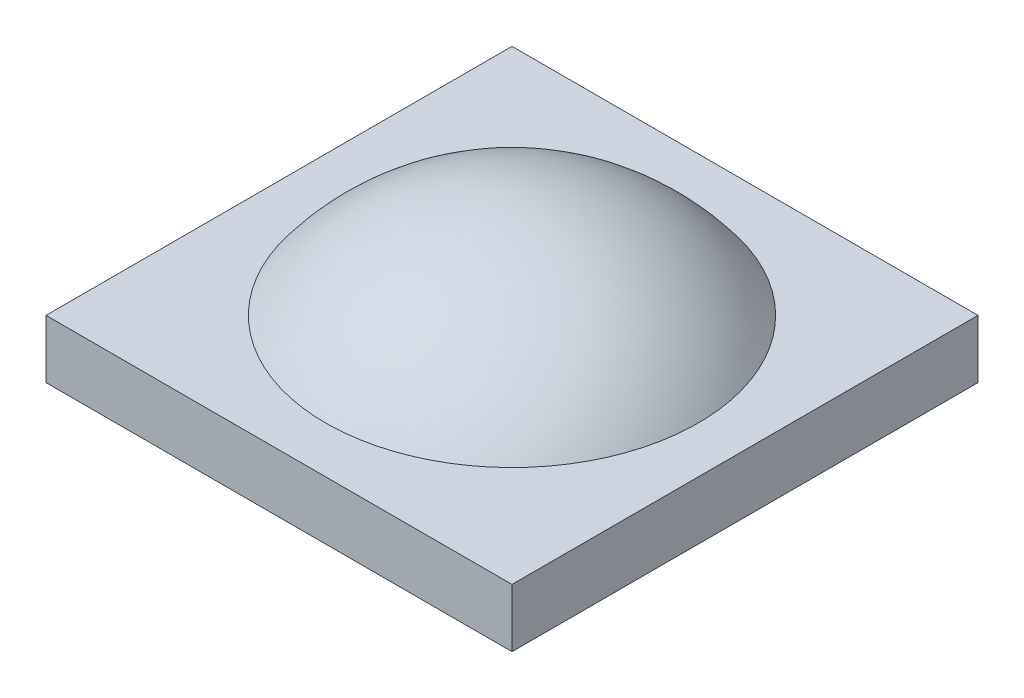
ISO-10303-21;
HEADER;
FILE_DESCRIPTION(('STEP AP214'),'2;1');
FILE_NAME('part.step','',(''),(''),'','','');
FILE_SCHEMA(('AUTOMOTIVE_DESIGN { 1 0 10303 214 1 1 1 1 }'));
ENDSEC;
DATA;
#1=APPLICATION_CONTEXT('core data for automotive mechanical design processes');
#2=APPLICATION_PROTOCOL_DEFINITION('international standard','automotive_design',2000,#1);
#3=PRODUCT_CONTEXT('',#1,'mechanical');
#4=PRODUCT('Part','Part','',(#3));
#5=PRODUCT_RELATED_PRODUCT_CATEGORY('part','',(#4));
#6=PRODUCT_DEFINITION_FORMATION('','',#4);
#7=PRODUCT_DEFINITION_CONTEXT('part definition',#1,'design');
#8=PRODUCT_DEFINITION('design','',#6,#7);
#9=PRODUCT_DEFINITION_SHAPE('','',#8);
#10=(LENGTH_UNIT() NAMED_UNIT(*) SI_UNIT(.MILLI.,.METRE.));
#11=(NAMED_UNIT(*) PLANE_ANGLE_UNIT() SI_UNIT($,.RADIAN.));
#12=(NAMED_UNIT(*) SI_UNIT($,.STERADIAN.) SOLID_ANGLE_UNIT());
#13=UNCERTAINTY_MEASURE_WITH_UNIT(LENGTH_MEASURE(1.E-05),#10,'distance_accuracy_value','');
#14=(GEOMETRIC_REPRESENTATION_CONTEXT(3) GLOBAL_UNCERTAINTY_ASSIGNED_CONTEXT((#13)) GLOBAL_UNIT_ASSIGNED_CONTEXT((#10,
#11,#12)) REPRESENTATION_CONTEXT('',''));
#15=CARTESIAN_POINT('',(0.,0.,0.));
#16=DIRECTION('',(0.,0.,1.));
#17=DIRECTION('',(1.,0.,0.));
#18=AXIS2_PLACEMENT_3D('',#15,#16,#17);
#19=CARTESIAN_POINT('',(25.4,6.35,25.4));
#20=DIRECTION('',(-1.,0.,0.));
#21=DIRECTION('',(0.,0.,1.));
#22=AXIS2_PLACEMENT_3D('',#19,#20,#21);
#23=PLANE('',#22);
#24=DIRECTION('',(0.,0.,-1.));
#25=VECTOR('',#24,1.);
#26=CARTESIAN_POINT('',(25.4,0.,25.4));
#27=LINE('',#26,#25);
#28=CARTESIAN_POINT('',(25.4,0.,25.4));
#29=VERTEX_POINT('',#28);
#30=CARTESIAN_POINT('',(25.4,0.,-25.4));
#31=VERTEX_POINT('',#30);
#32=EDGE_CURVE('E102',#29,#31,#27,.T.);
#33=ORIENTED_EDGE('',*,*,#32,.T.);
#34=DIRECTION('',(0.,-1.,0.));
#35=VECTOR('',#34,1.);
#36=CARTESIAN_POINT('',(25.4,6.35,-25.4));
#37=LINE('',#36,#35);
#38=CARTESIAN_POINT('',(25.4,6.35,-25.4));
#39=VERTEX_POINT('',#38);
#40=EDGE_CURVE('E11',#39,#31,#37,.T.);
#41=ORIENTED_EDGE('',*,*,#40,.F.);
#42=DIRECTION('',(0.,0.,-1.));
#43=VECTOR('',#42,1.);
#44=CARTESIAN_POINT('',(25.4,6.35,25.4));
#45=LINE('',#44,#43);
#46=CARTESIAN_POINT('',(25.4,6.35,25.4));
#47=VERTEX_POINT('',#46);
#48=EDGE_CURVE('E90',#47,#39,#45,.T.);
#49=ORIENTED_EDGE('',*,*,#48,.F.);
#50=DIRECTION('',(0.,-1.,0.));
#51=VECTOR('',#50,1.);
#52=CARTESIAN_POINT('',(25.4,6.35,25.4));
#53=LINE('',#52,#51);
#54=EDGE_CURVE('E98',#47,#29,#53,.T.);
#55=ORIENTED_EDGE('',*,*,#54,.T.);
#56=EDGE_LOOP('',(#33,#41,#49,#55));
#57=FACE_BOUND('',#56,.T.);
#58=ADVANCED_FACE('F39',(#57),#23,.F.);
#59=CARTESIAN_POINT('',(-25.4,6.35,-25.4));
#60=DIRECTION('',(0.,0.,1.));
#61=DIRECTION('',(1.,0.,0.));
#62=AXIS2_PLACEMENT_3D('',#59,#60,#61);
#63=PLANE('',#62);
#64=DIRECTION('',(-1.,0.,0.));
#65=VECTOR('',#64,1.);
#66=CARTESIAN_POINT('',(-25.4,0.,-25.4));
#67=LINE('',#66,#65);
#68=CARTESIAN_POINT('',(-25.4,0.,-25.4));
#69=VERTEX_POINT('',#68);
#70=EDGE_CURVE('E94',#31,#69,#67,.T.);
#71=ORIENTED_EDGE('',*,*,#70,.T.);
#72=DIRECTION('',(0.,-1.,0.));
#73=VECTOR('',#72,1.);
#74=CARTESIAN_POINT('',(-25.4,6.35,-25.4));
#75=LINE('',#74,#73);
#76=CARTESIAN_POINT('',(-25.4,6.35,-25.4));
#77=VERTEX_POINT('',#76);
#78=EDGE_CURVE('E47',#77,#69,#75,.T.);
#79=ORIENTED_EDGE('',*,*,#78,.F.);
#80=DIRECTION('',(-1.,0.,0.));
#81=VECTOR('',#80,1.);
#82=CARTESIAN_POINT('',(-25.4,6.35,-25.4));
#83=LINE('',#82,#81);
#84=EDGE_CURVE('E85',#39,#77,#83,.T.);
#85=ORIENTED_EDGE('',*,*,#84,.F.);
#86=ORIENTED_EDGE('',*,*,#40,.T.);
#87=EDGE_LOOP('',(#71,#79,#85,#86));
#88=FACE_BOUND('',#87,.T.);
#89=ADVANCED_FACE('F93',(#88),#63,.F.);
#90=CARTESIAN_POINT('',(-25.4,6.35,25.4));
#91=DIRECTION('',(1.,0.,0.));
#92=DIRECTION('',(0.,0.,-1.));
#93=AXIS2_PLACEMENT_3D('',#90,#91,#92);
#94=PLANE('',#93);
#95=DIRECTION('',(0.,0.,1.));
#96=VECTOR('',#95,1.);
#97=CARTESIAN_POINT('',(-25.4,0.,25.4));
#98=LINE('',#97,#96);
#99=CARTESIAN_POINT('',(-25.4,0.,25.4));
#100=VERTEX_POINT('',#99);
#101=EDGE_CURVE('E72',#69,#100,#98,.T.);
#102=ORIENTED_EDGE('',*,*,#101,.T.);
#103=DIRECTION('',(0.,-1.,0.));
#104=VECTOR('',#103,1.);
#105=CARTESIAN_POINT('',(-25.4,6.35,25.4));
#106=LINE('',#105,#104);
#107=CARTESIAN_POINT('',(-25.4,6.35,25.4));
#108=VERTEX_POINT('',#107);
#109=EDGE_CURVE('E95',#108,#100,#106,.T.);
#110=ORIENTED_EDGE('',*,*,#109,.F.);
#111=DIRECTION('',(0.,0.,1.));
#112=VECTOR('',#111,1.);
#113=CARTESIAN_POINT('',(-25.4,6.35,25.4));
#114=LINE('',#113,#112);
#115=EDGE_CURVE('E88',#77,#108,#114,.T.);
#116=ORIENTED_EDGE('',*,*,#115,.F.);
#117=ORIENTED_EDGE('',*,*,#78,.T.);
#118=EDGE_LOOP('',(#102,#110,#116,#117));
#119=FACE_BOUND('',#118,.T.);
#120=ADVANCED_FACE('F96',(#119),#94,.F.);
#121=CARTESIAN_POINT('',(-25.4,6.35,25.4));
#122=DIRECTION('',(0.,0.,-1.));
#123=DIRECTION('',(-1.,0.,0.));
#124=AXIS2_PLACEMENT_3D('',#121,#122,#123);
#125=PLANE('',#124);
#126=DIRECTION('',(1.,0.,0.));
#127=VECTOR('',#126,1.);
#128=CARTESIAN_POINT('',(-25.4,0.,25.4));
#129=LINE('',#128,#127);
#130=EDGE_CURVE('E78',#100,#29,#129,.T.);
#131=ORIENTED_EDGE('',*,*,#130,.T.);
#132=ORIENTED_EDGE('',*,*,#54,.F.);
#133=DIRECTION('',(1.,0.,0.));
#134=VECTOR('',#133,1.);
#135=CARTESIAN_POINT('',(-25.4,6.35,25.4));
#136=LINE('',#135,#134);
#137=EDGE_CURVE('E55',#108,#47,#136,.T.);
#138=ORIENTED_EDGE('',*,*,#137,.F.);
#139=ORIENTED_EDGE('',*,*,#109,.T.);
#140=EDGE_LOOP('',(#131,#132,#138,#139));
#141=FACE_BOUND('',#140,.T.);
#142=ADVANCED_FACE('F110',(#141),#125,.F.);
#143=CARTESIAN_POINT('',(0.,6.35,0.));
#144=DIRECTION('',(0.,-1.,0.));
#145=DIRECTION('',(0.,0.,-1.));
#146=AXIS2_PLACEMENT_3D('',#143,#144,#145);
#147=PLANE('',#146);
#148=CARTESIAN_POINT('',(0.,6.35,0.));
#149=DIRECTION('',(0.,1.,0.));
#150=DIRECTION('',(-1.,0.,0.));
#151=AXIS2_PLACEMENT_3D('',#148,#149,#150);
#152=CIRCLE('',#151,20.32);
#153=CARTESIAN_POINT('',(-20.32,6.35,0.));
#154=VERTEX_POINT('',#153);
#155=EDGE_CURVE('E105',#154,#154,#152,.T.);
#156=ORIENTED_EDGE('',*,*,#155,.F.);
#157=EDGE_LOOP('',(#156));
#158=FACE_BOUND('',#157,.T.);
#159=ORIENTED_EDGE('',*,*,#48,.T.);
#160=ORIENTED_EDGE('',*,*,#84,.T.);
#161=ORIENTED_EDGE('',*,*,#115,.T.);
#162=ORIENTED_EDGE('',*,*,#137,.T.);
#163=EDGE_LOOP('',(#159,#160,#161,#162));
#164=FACE_BOUND('',#163,.T.);
#165=ADVANCED_FACE('F86',(#158,#164),#147,.F.);
#166=CARTESIAN_POINT('',(0.,0.,0.));
#167=DIRECTION('',(0.,-1.,0.));
#168=DIRECTION('',(0.,0.,-1.));
#169=AXIS2_PLACEMENT_3D('',#166,#167,#168);
#170=PLANE('',#169);
#171=ORIENTED_EDGE('',*,*,#32,.F.);
#172=ORIENTED_EDGE('',*,*,#130,.F.);
#173=ORIENTED_EDGE('',*,*,#101,.F.);
#174=ORIENTED_EDGE('',*,*,#70,.F.);
#175=EDGE_LOOP('',(#171,#172,#173,#174));
#176=FACE_BOUND('',#175,.T.);
#177=ADVANCED_FACE('F113',(#176),#170,.T.);
#178=CARTESIAN_POINT('',(0.,-8.89,0.));
#179=DIRECTION('',(0.,1.,0.));
#180=DIRECTION('',(-1.,0.,0.));
#181=AXIS2_PLACEMENT_3D('',#178,#179,#180);
#182=SPHERICAL_SURFACE('',#181,25.4);
#183=ORIENTED_EDGE('',*,*,#155,.T.);
#184=EDGE_LOOP('',(#183));
#185=FACE_BOUND('',#184,.T.);
#186=ADVANCED_FACE('F119',(#185),#182,.T.);
#187=CLOSED_SHELL('',(#58,#89,#120,#142,#165,#177,#186));
#188=MANIFOLD_SOLID_BREP('B2',#187);
#189=ADVANCED_BREP_SHAPE_REPRESENTATION('',(#18,#188),#14);
#190=SHAPE_DEFINITION_REPRESENTATION(#9,#189);
ENDSEC;
END-ISO-10303-21;
